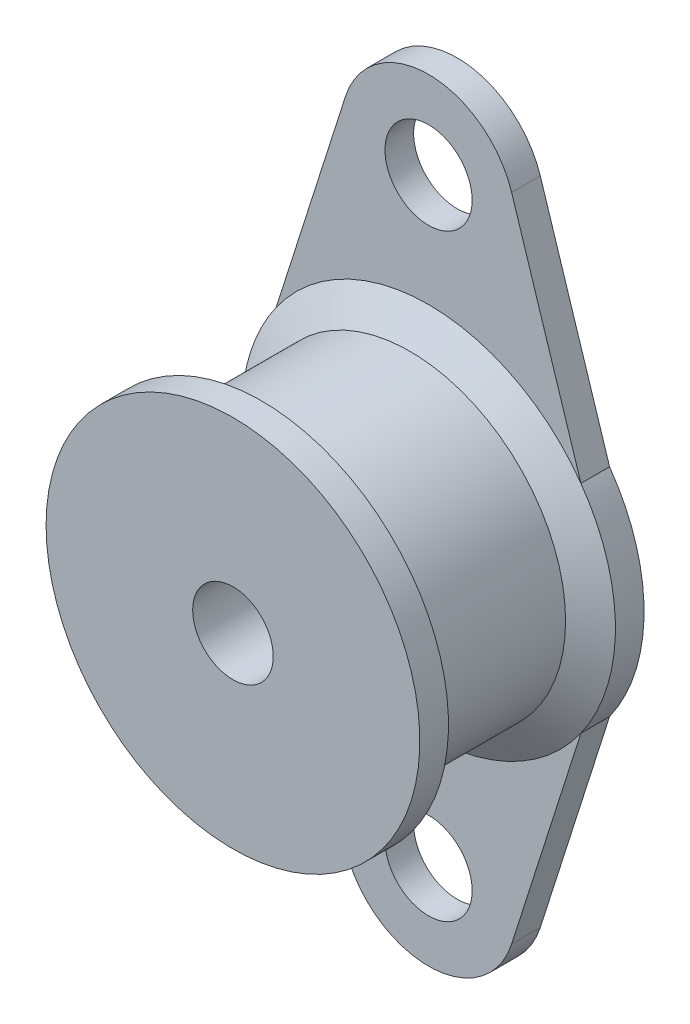
ISO-10303-21;
HEADER;
FILE_DESCRIPTION(('STEP AP214'),'2;1');
FILE_NAME('part.step','',(''),(''),'','','');
FILE_SCHEMA(('AUTOMOTIVE_DESIGN { 1 0 10303 214 1 1 1 1 }'));
ENDSEC;
DATA;
#1=APPLICATION_CONTEXT('core data for automotive mechanical design processes');
#2=APPLICATION_PROTOCOL_DEFINITION('international standard','automotive_design',2000,#1);
#3=PRODUCT_CONTEXT('',#1,'mechanical');
#4=PRODUCT('Part','Part','',(#3));
#5=PRODUCT_RELATED_PRODUCT_CATEGORY('part','',(#4));
#6=PRODUCT_DEFINITION_FORMATION('','',#4);
#7=PRODUCT_DEFINITION_CONTEXT('part definition',#1,'design');
#8=PRODUCT_DEFINITION('design','',#6,#7);
#9=PRODUCT_DEFINITION_SHAPE('','',#8);
#10=(LENGTH_UNIT() NAMED_UNIT(*) SI_UNIT(.MILLI.,.METRE.));
#11=(NAMED_UNIT(*) PLANE_ANGLE_UNIT() SI_UNIT($,.RADIAN.));
#12=(NAMED_UNIT(*) SI_UNIT($,.STERADIAN.) SOLID_ANGLE_UNIT());
#13=UNCERTAINTY_MEASURE_WITH_UNIT(LENGTH_MEASURE(1.E-05),#10,'distance_accuracy_value','');
#14=(GEOMETRIC_REPRESENTATION_CONTEXT(3) GLOBAL_UNCERTAINTY_ASSIGNED_CONTEXT((#13)) GLOBAL_UNIT_ASSIGNED_CONTEXT((#10,
#11,#12)) REPRESENTATION_CONTEXT('',''));
#15=CARTESIAN_POINT('',(0.,0.,0.));
#16=DIRECTION('',(0.,0.,1.));
#17=DIRECTION('',(1.,0.,0.));
#18=AXIS2_PLACEMENT_3D('',#15,#16,#17);
#19=CARTESIAN_POINT('',(15.,0.,18.));
#20=DIRECTION('',(0.,0.,-1.));
#21=DIRECTION('',(-1.,0.,0.));
#22=AXIS2_PLACEMENT_3D('',#19,#20,#21);
#23=PLANE('',#22);
#24=CARTESIAN_POINT('',(0.,0.,18.));
#25=DIRECTION('',(0.,0.,-1.));
#26=DIRECTION('',(-1.,0.,0.));
#27=AXIS2_PLACEMENT_3D('',#24,#25,#26);
#28=CIRCLE('',#27,15.);
#29=CARTESIAN_POINT('',(-15.,0.,18.));
#30=VERTEX_POINT('',#29);
#31=EDGE_CURVE('E288',#30,#30,#28,.T.);
#32=ORIENTED_EDGE('',*,*,#31,.F.);
#33=EDGE_LOOP('',(#32));
#34=FACE_BOUND('',#33,.T.);
#35=CARTESIAN_POINT('',(0.,0.,18.));
#36=DIRECTION('',(0.,0.,-1.));
#37=DIRECTION('',(-1.,0.,0.));
#38=AXIS2_PLACEMENT_3D('',#35,#36,#37);
#39=CIRCLE('',#38,3.233);
#40=CARTESIAN_POINT('',(-3.233,0.,18.));
#41=VERTEX_POINT('',#40);
#42=EDGE_CURVE('E297',#41,#41,#39,.T.);
#43=ORIENTED_EDGE('',*,*,#42,.T.);
#44=EDGE_LOOP('',(#43));
#45=FACE_BOUND('',#44,.T.);
#46=ADVANCED_FACE('F38',(#34,#45),#23,.F.);
#47=CARTESIAN_POINT('',(0.,0.,2.3));
#48=DIRECTION('',(0.,0.,1.));
#49=DIRECTION('',(1.,0.,0.));
#50=AXIS2_PLACEMENT_3D('',#47,#48,#49);
#51=PLANE('',#50);
#52=CARTESIAN_POINT('',(0.,24.,2.3));
#53=DIRECTION('',(0.,0.,1.));
#54=DIRECTION('',(1.,0.,0.));
#55=AXIS2_PLACEMENT_3D('',#52,#53,#54);
#56=CIRCLE('',#55,3.5);
#57=CARTESIAN_POINT('',(3.5,24.,2.3));
#58=VERTEX_POINT('',#57);
#59=EDGE_CURVE('E269',#58,#58,#56,.T.);
#60=ORIENTED_EDGE('',*,*,#59,.F.);
#61=EDGE_LOOP('',(#60));
#62=FACE_BOUND('',#61,.T.);
#63=DIRECTION('',(-0.303794352089966,-0.952737630010612,0.));
#64=VECTOR('',#63,1.);
#65=CARTESIAN_POINT('',(-6.66916341007428,26.1265604646298,2.3));
#66=LINE('',#65,#64);
#67=CARTESIAN_POINT('',(-6.66916341007428,26.1265604646298,2.3));
#68=VERTEX_POINT('',#67);
#69=CARTESIAN_POINT('',(-12.2312697491471,8.68308933062412,2.3));
#70=VERTEX_POINT('',#69);
#71=EDGE_CURVE('E57',#68,#70,#66,.T.);
#72=ORIENTED_EDGE('',*,*,#71,.T.);
#73=CARTESIAN_POINT('',(0.,0.,2.3));
#74=DIRECTION('',(0.,0.,-1.));
#75=DIRECTION('',(-1.,0.,0.));
#76=AXIS2_PLACEMENT_3D('',#73,#74,#75);
#77=CIRCLE('',#76,15.);
#78=CARTESIAN_POINT('',(12.2312697491471,8.68308933062411,2.3));
#79=VERTEX_POINT('',#78);
#80=EDGE_CURVE('E118',#70,#79,#77,.T.);
#81=ORIENTED_EDGE('',*,*,#80,.T.);
#82=DIRECTION('',(-0.303794352089966,0.952737630010612,0.));
#83=VECTOR('',#82,1.);
#84=CARTESIAN_POINT('',(12.2312697491471,8.68308933062411,2.3));
#85=LINE('',#84,#83);
#86=CARTESIAN_POINT('',(6.66916341007428,26.1265604646298,2.3));
#87=VERTEX_POINT('',#86);
#88=EDGE_CURVE('E112',#79,#87,#85,.T.);
#89=ORIENTED_EDGE('',*,*,#88,.T.);
#90=CARTESIAN_POINT('',(0.,24.,2.3));
#91=DIRECTION('',(0.,0.,1.));
#92=DIRECTION('',(1.,0.,0.));
#93=AXIS2_PLACEMENT_3D('',#90,#91,#92);
#94=CIRCLE('',#93,7.);
#95=EDGE_CURVE('E116',#87,#68,#94,.T.);
#96=ORIENTED_EDGE('',*,*,#95,.T.);
#97=EDGE_LOOP('',(#72,#81,#89,#96));
#98=FACE_BOUND('',#97,.T.);
#99=ADVANCED_FACE('F114',(#62,#98),#51,.T.);
#100=CARTESIAN_POINT('',(0.,-24.,2.3));
#101=DIRECTION('',(0.,0.,1.));
#102=DIRECTION('',(1.,0.,0.));
#103=AXIS2_PLACEMENT_3D('',#100,#101,#102);
#104=CIRCLE('',#103,3.5);
#105=CARTESIAN_POINT('',(3.5,-24.,2.3));
#106=VERTEX_POINT('',#105);
#107=EDGE_CURVE('E144',#106,#106,#104,.T.);
#108=ORIENTED_EDGE('',*,*,#107,.F.);
#109=EDGE_LOOP('',(#108));
#110=FACE_BOUND('',#109,.T.);
#111=DIRECTION('',(0.303794352089966,0.952737630010612,0.));
#112=VECTOR('',#111,1.);
#113=CARTESIAN_POINT('',(6.66916341007428,-26.1265604646298,2.3));
#114=LINE('',#113,#112);
#115=CARTESIAN_POINT('',(6.66916341007428,-26.1265604646298,2.3));
#116=VERTEX_POINT('',#115);
#117=CARTESIAN_POINT('',(12.2312697491471,-8.68308933062411,2.3));
#118=VERTEX_POINT('',#117);
#119=EDGE_CURVE('E181',#116,#118,#114,.T.);
#120=ORIENTED_EDGE('',*,*,#119,.T.);
#121=CARTESIAN_POINT('',(-12.2312697491471,-8.68308933062411,2.3));
#122=VERTEX_POINT('',#121);
#123=EDGE_CURVE('E11',#118,#122,#77,.T.);
#124=ORIENTED_EDGE('',*,*,#123,.T.);
#125=DIRECTION('',(0.303794352089966,-0.952737630010612,0.));
#126=VECTOR('',#125,1.);
#127=CARTESIAN_POINT('',(-12.2312697491471,-8.68308933062411,2.3));
#128=LINE('',#127,#126);
#129=CARTESIAN_POINT('',(-6.66916341007428,-26.1265604646298,2.3));
#130=VERTEX_POINT('',#129);
#131=EDGE_CURVE('E101',#122,#130,#128,.T.);
#132=ORIENTED_EDGE('',*,*,#131,.T.);
#133=CARTESIAN_POINT('',(0.,-24.,2.3));
#134=DIRECTION('',(0.,0.,1.));
#135=DIRECTION('',(1.,0.,0.));
#136=AXIS2_PLACEMENT_3D('',#133,#134,#135);
#137=CIRCLE('',#136,7.);
#138=EDGE_CURVE('E138',#130,#116,#137,.T.);
#139=ORIENTED_EDGE('',*,*,#138,.T.);
#140=EDGE_LOOP('',(#120,#124,#132,#139));
#141=FACE_BOUND('',#140,.T.);
#142=ADVANCED_FACE('F230',(#110,#141),#51,.T.);
#143=CARTESIAN_POINT('',(0.,0.,0.));
#144=DIRECTION('',(0.,0.,1.));
#145=DIRECTION('',(1.,0.,0.));
#146=AXIS2_PLACEMENT_3D('',#143,#144,#145);
#147=PLANE('',#146);
#148=CARTESIAN_POINT('',(0.,-24.,0.));
#149=DIRECTION('',(0.,0.,1.));
#150=DIRECTION('',(1.,0.,0.));
#151=AXIS2_PLACEMENT_3D('',#148,#149,#150);
#152=CIRCLE('',#151,3.5);
#153=CARTESIAN_POINT('',(3.5,-24.,0.));
#154=VERTEX_POINT('',#153);
#155=EDGE_CURVE('E267',#154,#154,#152,.T.);
#156=ORIENTED_EDGE('',*,*,#155,.T.);
#157=EDGE_LOOP('',(#156));
#158=FACE_BOUND('',#157,.T.);
#159=CARTESIAN_POINT('',(0.,0.,0.));
#160=DIRECTION('',(0.,0.,1.));
#161=DIRECTION('',(1.,0.,0.));
#162=AXIS2_PLACEMENT_3D('',#159,#160,#161);
#163=CIRCLE('',#162,15.);
#164=CARTESIAN_POINT('',(-12.2312697491471,8.68308933062412,0.));
#165=VERTEX_POINT('',#164);
#166=CARTESIAN_POINT('',(-12.2312697491471,-8.68308933062411,0.));
#167=VERTEX_POINT('',#166);
#168=EDGE_CURVE('E140',#165,#167,#163,.T.);
#169=ORIENTED_EDGE('',*,*,#168,.F.);
#170=DIRECTION('',(-0.303794352089966,-0.952737630010612,0.));
#171=VECTOR('',#170,1.);
#172=CARTESIAN_POINT('',(-6.66916341007428,26.1265604646298,0.));
#173=LINE('',#172,#171);
#174=CARTESIAN_POINT('',(-6.66916341007428,26.1265604646298,0.));
#175=VERTEX_POINT('',#174);
#176=EDGE_CURVE('E93',#175,#165,#173,.T.);
#177=ORIENTED_EDGE('',*,*,#176,.F.);
#178=CARTESIAN_POINT('',(0.,24.,0.));
#179=DIRECTION('',(0.,0.,1.));
#180=DIRECTION('',(1.,0.,0.));
#181=AXIS2_PLACEMENT_3D('',#178,#179,#180);
#182=CIRCLE('',#181,7.);
#183=CARTESIAN_POINT('',(6.66916341007428,26.1265604646298,0.));
#184=VERTEX_POINT('',#183);
#185=EDGE_CURVE('E87',#184,#175,#182,.T.);
#186=ORIENTED_EDGE('',*,*,#185,.F.);
#187=DIRECTION('',(-0.303794352089966,0.952737630010612,0.));
#188=VECTOR('',#187,1.);
#189=CARTESIAN_POINT('',(12.2312697491471,8.68308933062411,0.));
#190=LINE('',#189,#188);
#191=CARTESIAN_POINT('',(12.2312697491471,8.68308933062411,0.));
#192=VERTEX_POINT('',#191);
#193=EDGE_CURVE('E128',#192,#184,#190,.T.);
#194=ORIENTED_EDGE('',*,*,#193,.F.);
#195=CARTESIAN_POINT('',(0.,0.,0.));
#196=DIRECTION('',(0.,0.,1.));
#197=DIRECTION('',(1.,0.,0.));
#198=AXIS2_PLACEMENT_3D('',#195,#196,#197);
#199=CIRCLE('',#198,15.);
#200=CARTESIAN_POINT('',(12.2312697491471,-8.68308933062411,0.));
#201=VERTEX_POINT('',#200);
#202=EDGE_CURVE('E150',#201,#192,#199,.T.);
#203=ORIENTED_EDGE('',*,*,#202,.F.);
#204=DIRECTION('',(0.303794352089966,0.952737630010612,0.));
#205=VECTOR('',#204,1.);
#206=CARTESIAN_POINT('',(6.66916341007428,-26.1265604646298,0.));
#207=LINE('',#206,#205);
#208=CARTESIAN_POINT('',(6.66916341007428,-26.1265604646298,0.));
#209=VERTEX_POINT('',#208);
#210=EDGE_CURVE('E148',#209,#201,#207,.T.);
#211=ORIENTED_EDGE('',*,*,#210,.F.);
#212=CARTESIAN_POINT('',(0.,-24.,0.));
#213=DIRECTION('',(0.,0.,1.));
#214=DIRECTION('',(1.,0.,0.));
#215=AXIS2_PLACEMENT_3D('',#212,#213,#214);
#216=CIRCLE('',#215,7.);
#217=CARTESIAN_POINT('',(-6.66916341007428,-26.1265604646298,0.));
#218=VERTEX_POINT('',#217);
#219=EDGE_CURVE('E146',#218,#209,#216,.T.);
#220=ORIENTED_EDGE('',*,*,#219,.F.);
#221=DIRECTION('',(0.303794352089966,-0.952737630010612,0.));
#222=VECTOR('',#221,1.);
#223=CARTESIAN_POINT('',(-12.2312697491471,-8.68308933062411,0.));
#224=LINE('',#223,#222);
#225=EDGE_CURVE('E143',#167,#218,#224,.T.);
#226=ORIENTED_EDGE('',*,*,#225,.F.);
#227=EDGE_LOOP('',(#169,#177,#186,#194,#203,#211,#220,#226));
#228=FACE_BOUND('',#227,.T.);
#229=CARTESIAN_POINT('',(0.,24.,0.));
#230=DIRECTION('',(0.,0.,1.));
#231=DIRECTION('',(1.,0.,0.));
#232=AXIS2_PLACEMENT_3D('',#229,#230,#231);
#233=CIRCLE('',#232,3.5);
#234=CARTESIAN_POINT('',(3.5,24.,0.));
#235=VERTEX_POINT('',#234);
#236=EDGE_CURVE('E273',#235,#235,#233,.T.);
#237=ORIENTED_EDGE('',*,*,#236,.T.);
#238=EDGE_LOOP('',(#237));
#239=FACE_BOUND('',#238,.T.);
#240=ADVANCED_FACE('F203',(#158,#228,#239),#147,.F.);
#241=CARTESIAN_POINT('',(0.,0.,2.3));
#242=DIRECTION('',(0.,0.,-1.));
#243=DIRECTION('',(-1.,0.,0.));
#244=AXIS2_PLACEMENT_3D('',#241,#242,#243);
#245=CYLINDRICAL_SURFACE('',#244,15.);
#246=ORIENTED_EDGE('',*,*,#168,.T.);
#247=DIRECTION('',(0.,0.,-1.));
#248=VECTOR('',#247,1.);
#249=CARTESIAN_POINT('',(-12.2312697491471,-8.68308933062411,2.3));
#250=LINE('',#249,#248);
#251=EDGE_CURVE('E48',#122,#167,#250,.T.);
#252=ORIENTED_EDGE('',*,*,#251,.F.);
#253=CARTESIAN_POINT('',(0.,0.,2.3));
#254=DIRECTION('',(0.,0.,1.));
#255=DIRECTION('',(1.,0.,0.));
#256=AXIS2_PLACEMENT_3D('',#253,#254,#255);
#257=CIRCLE('',#256,15.);
#258=EDGE_CURVE('E155',#70,#122,#257,.T.);
#259=ORIENTED_EDGE('',*,*,#258,.F.);
#260=DIRECTION('',(0.,0.,-1.));
#261=VECTOR('',#260,1.);
#262=CARTESIAN_POINT('',(-12.2312697491471,8.68308933062412,2.3));
#263=LINE('',#262,#261);
#264=EDGE_CURVE('E134',#70,#165,#263,.T.);
#265=ORIENTED_EDGE('',*,*,#264,.T.);
#266=EDGE_LOOP('',(#246,#252,#259,#265));
#267=FACE_BOUND('',#266,.T.);
#268=ADVANCED_FACE('F40',(#267),#245,.T.);
#269=CARTESIAN_POINT('',(-12.2312697491471,-8.68308933062411,2.3));
#270=DIRECTION('',(0.952737630010612,0.303794352089966,0.));
#271=DIRECTION('',(-0.303794352089966,0.952737630010612,0.));
#272=AXIS2_PLACEMENT_3D('',#269,#270,#271);
#273=PLANE('',#272);
#274=ORIENTED_EDGE('',*,*,#225,.T.);
#275=DIRECTION('',(0.,0.,-1.));
#276=VECTOR('',#275,1.);
#277=CARTESIAN_POINT('',(-6.66916341007428,-26.1265604646298,2.3));
#278=LINE('',#277,#276);
#279=EDGE_CURVE('E160',#130,#218,#278,.T.);
#280=ORIENTED_EDGE('',*,*,#279,.F.);
#281=ORIENTED_EDGE('',*,*,#131,.F.);
#282=ORIENTED_EDGE('',*,*,#251,.T.);
#283=EDGE_LOOP('',(#274,#280,#281,#282));
#284=FACE_BOUND('',#283,.T.);
#285=ADVANCED_FACE('F263',(#284),#273,.F.);
#286=CARTESIAN_POINT('',(0.,-24.,2.3));
#287=DIRECTION('',(0.,0.,-1.));
#288=DIRECTION('',(-1.,0.,0.));
#289=AXIS2_PLACEMENT_3D('',#286,#287,#288);
#290=CYLINDRICAL_SURFACE('',#289,7.);
#291=ORIENTED_EDGE('',*,*,#219,.T.);
#292=DIRECTION('',(0.,0.,-1.));
#293=VECTOR('',#292,1.);
#294=CARTESIAN_POINT('',(6.66916341007428,-26.1265604646298,2.3));
#295=LINE('',#294,#293);
#296=EDGE_CURVE('E157',#116,#209,#295,.T.);
#297=ORIENTED_EDGE('',*,*,#296,.F.);
#298=ORIENTED_EDGE('',*,*,#138,.F.);
#299=ORIENTED_EDGE('',*,*,#279,.T.);
#300=EDGE_LOOP('',(#291,#297,#298,#299));
#301=FACE_BOUND('',#300,.T.);
#302=ADVANCED_FACE('F375',(#301),#290,.T.);
#303=CARTESIAN_POINT('',(6.66916341007428,-26.1265604646298,2.3));
#304=DIRECTION('',(-0.952737630010612,0.303794352089966,0.));
#305=DIRECTION('',(-0.303794352089966,-0.952737630010612,0.));
#306=AXIS2_PLACEMENT_3D('',#303,#304,#305);
#307=PLANE('',#306);
#308=ORIENTED_EDGE('',*,*,#210,.T.);
#309=DIRECTION('',(0.,0.,-1.));
#310=VECTOR('',#309,1.);
#311=CARTESIAN_POINT('',(12.2312697491471,-8.68308933062411,2.3));
#312=LINE('',#311,#310);
#313=EDGE_CURVE('E161',#118,#201,#312,.T.);
#314=ORIENTED_EDGE('',*,*,#313,.F.);
#315=ORIENTED_EDGE('',*,*,#119,.F.);
#316=ORIENTED_EDGE('',*,*,#296,.T.);
#317=EDGE_LOOP('',(#308,#314,#315,#316));
#318=FACE_BOUND('',#317,.T.);
#319=ADVANCED_FACE('F364',(#318),#307,.F.);
#320=CARTESIAN_POINT('',(0.,0.,2.3));
#321=DIRECTION('',(0.,0.,-1.));
#322=DIRECTION('',(-1.,0.,0.));
#323=AXIS2_PLACEMENT_3D('',#320,#321,#322);
#324=CYLINDRICAL_SURFACE('',#323,15.);
#325=ORIENTED_EDGE('',*,*,#202,.T.);
#326=DIRECTION('',(0.,0.,-1.));
#327=VECTOR('',#326,1.);
#328=CARTESIAN_POINT('',(12.2312697491471,8.68308933062411,2.3));
#329=LINE('',#328,#327);
#330=EDGE_CURVE('E129',#79,#192,#329,.T.);
#331=ORIENTED_EDGE('',*,*,#330,.F.);
#332=CARTESIAN_POINT('',(0.,0.,2.3));
#333=DIRECTION('',(0.,0.,1.));
#334=DIRECTION('',(1.,0.,0.));
#335=AXIS2_PLACEMENT_3D('',#332,#333,#334);
#336=CIRCLE('',#335,15.);
#337=EDGE_CURVE('E123',#118,#79,#336,.T.);
#338=ORIENTED_EDGE('',*,*,#337,.F.);
#339=ORIENTED_EDGE('',*,*,#313,.T.);
#340=EDGE_LOOP('',(#325,#331,#338,#339));
#341=FACE_BOUND('',#340,.T.);
#342=ADVANCED_FACE('F196',(#341),#324,.T.);
#343=CARTESIAN_POINT('',(12.2312697491471,8.68308933062411,2.3));
#344=DIRECTION('',(-0.952737630010612,-0.303794352089966,0.));
#345=DIRECTION('',(0.303794352089966,-0.952737630010612,0.));
#346=AXIS2_PLACEMENT_3D('',#343,#344,#345);
#347=PLANE('',#346);
#348=ORIENTED_EDGE('',*,*,#193,.T.);
#349=DIRECTION('',(0.,0.,-1.));
#350=VECTOR('',#349,1.);
#351=CARTESIAN_POINT('',(6.66916341007428,26.1265604646298,2.3));
#352=LINE('',#351,#350);
#353=EDGE_CURVE('E125',#87,#184,#352,.T.);
#354=ORIENTED_EDGE('',*,*,#353,.F.);
#355=ORIENTED_EDGE('',*,*,#88,.F.);
#356=ORIENTED_EDGE('',*,*,#330,.T.);
#357=EDGE_LOOP('',(#348,#354,#355,#356));
#358=FACE_BOUND('',#357,.T.);
#359=ADVANCED_FACE('F126',(#358),#347,.F.);
#360=CARTESIAN_POINT('',(0.,24.,2.3));
#361=DIRECTION('',(0.,0.,-1.));
#362=DIRECTION('',(-1.,0.,0.));
#363=AXIS2_PLACEMENT_3D('',#360,#361,#362);
#364=CYLINDRICAL_SURFACE('',#363,7.);
#365=ORIENTED_EDGE('',*,*,#185,.T.);
#366=DIRECTION('',(0.,0.,-1.));
#367=VECTOR('',#366,1.);
#368=CARTESIAN_POINT('',(-6.66916341007428,26.1265604646298,2.3));
#369=LINE('',#368,#367);
#370=EDGE_CURVE('E130',#68,#175,#369,.T.);
#371=ORIENTED_EDGE('',*,*,#370,.F.);
#372=ORIENTED_EDGE('',*,*,#95,.F.);
#373=ORIENTED_EDGE('',*,*,#353,.T.);
#374=EDGE_LOOP('',(#365,#371,#372,#373));
#375=FACE_BOUND('',#374,.T.);
#376=ADVANCED_FACE('F132',(#375),#364,.T.);
#377=CARTESIAN_POINT('',(-6.66916341007428,26.1265604646298,2.3));
#378=DIRECTION('',(0.952737630010612,-0.303794352089966,0.));
#379=DIRECTION('',(0.303794352089966,0.952737630010612,0.));
#380=AXIS2_PLACEMENT_3D('',#377,#378,#379);
#381=PLANE('',#380);
#382=ORIENTED_EDGE('',*,*,#176,.T.);
#383=ORIENTED_EDGE('',*,*,#264,.F.);
#384=ORIENTED_EDGE('',*,*,#71,.F.);
#385=ORIENTED_EDGE('',*,*,#370,.T.);
#386=EDGE_LOOP('',(#382,#383,#384,#385));
#387=FACE_BOUND('',#386,.T.);
#388=ADVANCED_FACE('F211',(#387),#381,.F.);
#389=CARTESIAN_POINT('',(0.,-24.,2.3));
#390=DIRECTION('',(0.,0.,-1.));
#391=DIRECTION('',(-1.,0.,0.));
#392=AXIS2_PLACEMENT_3D('',#389,#390,#391);
#393=CYLINDRICAL_SURFACE('',#392,3.5);
#394=ORIENTED_EDGE('',*,*,#107,.T.);
#395=EDGE_LOOP('',(#394));
#396=FACE_BOUND('',#395,.T.);
#397=ORIENTED_EDGE('',*,*,#155,.F.);
#398=EDGE_LOOP('',(#397));
#399=FACE_BOUND('',#398,.T.);
#400=ADVANCED_FACE('F213',(#396,#399),#393,.F.);
#401=CARTESIAN_POINT('',(0.,24.,2.3));
#402=DIRECTION('',(0.,0.,-1.));
#403=DIRECTION('',(-1.,0.,0.));
#404=AXIS2_PLACEMENT_3D('',#401,#402,#403);
#405=CYLINDRICAL_SURFACE('',#404,3.5);
#406=ORIENTED_EDGE('',*,*,#59,.T.);
#407=EDGE_LOOP('',(#406));
#408=FACE_BOUND('',#407,.T.);
#409=ORIENTED_EDGE('',*,*,#236,.F.);
#410=EDGE_LOOP('',(#409));
#411=FACE_BOUND('',#410,.T.);
#412=ADVANCED_FACE('F219',(#408,#411),#405,.F.);
#413=CARTESIAN_POINT('',(0.,0.,3.8));
#414=DIRECTION('',(0.,0.,-1.));
#415=DIRECTION('',(-1.,0.,0.));
#416=AXIS2_PLACEMENT_3D('',#413,#414,#415);
#417=CONICAL_SURFACE('',#416,12.5,1.03037682652431);
#418=ORIENTED_EDGE('',*,*,#80,.F.);
#419=ORIENTED_EDGE('',*,*,#258,.T.);
#420=ORIENTED_EDGE('',*,*,#123,.F.);
#421=ORIENTED_EDGE('',*,*,#337,.T.);
#422=EDGE_LOOP('',(#418,#419,#420,#421));
#423=FACE_BOUND('',#422,.T.);
#424=CARTESIAN_POINT('',(0.,0.,3.8));
#425=DIRECTION('',(0.,0.,-1.));
#426=DIRECTION('',(-1.,0.,0.));
#427=AXIS2_PLACEMENT_3D('',#424,#425,#426);
#428=CIRCLE('',#427,12.5);
#429=CARTESIAN_POINT('',(-12.5,0.,3.8));
#430=VERTEX_POINT('',#429);
#431=EDGE_CURVE('E277',#430,#430,#428,.T.);
#432=ORIENTED_EDGE('',*,*,#431,.T.);
#433=EDGE_LOOP('',(#432));
#434=FACE_BOUND('',#433,.T.);
#435=ADVANCED_FACE('F250',(#423,#434),#417,.T.);
#436=CARTESIAN_POINT('',(0.,0.,15.7));
#437=DIRECTION('',(0.,0.,-1.));
#438=DIRECTION('',(-1.,0.,0.));
#439=AXIS2_PLACEMENT_3D('',#436,#437,#438);
#440=CYLINDRICAL_SURFACE('',#439,12.5);
#441=ORIENTED_EDGE('',*,*,#431,.F.);
#442=EDGE_LOOP('',(#441));
#443=FACE_BOUND('',#442,.T.);
#444=CARTESIAN_POINT('',(0.,0.,14.2));
#445=DIRECTION('',(0.,0.,-1.));
#446=DIRECTION('',(-1.,0.,0.));
#447=AXIS2_PLACEMENT_3D('',#444,#445,#446);
#448=CIRCLE('',#447,12.5);
#449=CARTESIAN_POINT('',(-12.5,0.,14.2));
#450=VERTEX_POINT('',#449);
#451=EDGE_CURVE('E279',#450,#450,#448,.T.);
#452=ORIENTED_EDGE('',*,*,#451,.T.);
#453=EDGE_LOOP('',(#452));
#454=FACE_BOUND('',#453,.T.);
#455=ADVANCED_FACE('F246',(#443,#454),#440,.T.);
#456=CARTESIAN_POINT('',(0.,0.,15.7));
#457=DIRECTION('',(0.,0.,1.));
#458=DIRECTION('',(1.,0.,0.));
#459=AXIS2_PLACEMENT_3D('',#456,#457,#458);
#460=CONICAL_SURFACE('',#459,15.,1.03037682652431);
#461=ORIENTED_EDGE('',*,*,#451,.F.);
#462=EDGE_LOOP('',(#461));
#463=FACE_BOUND('',#462,.T.);
#464=CARTESIAN_POINT('',(0.,0.,15.7));
#465=DIRECTION('',(0.,0.,-1.));
#466=DIRECTION('',(-1.,0.,0.));
#467=AXIS2_PLACEMENT_3D('',#464,#465,#466);
#468=CIRCLE('',#467,15.);
#469=CARTESIAN_POINT('',(-15.,0.,15.7));
#470=VERTEX_POINT('',#469);
#471=EDGE_CURVE('E283',#470,#470,#468,.T.);
#472=ORIENTED_EDGE('',*,*,#471,.T.);
#473=EDGE_LOOP('',(#472));
#474=FACE_BOUND('',#473,.T.);
#475=ADVANCED_FACE('F242',(#463,#474),#460,.T.);
#476=CARTESIAN_POINT('',(0.,0.,18.));
#477=DIRECTION('',(0.,0.,-1.));
#478=DIRECTION('',(-1.,0.,0.));
#479=AXIS2_PLACEMENT_3D('',#476,#477,#478);
#480=CYLINDRICAL_SURFACE('',#479,15.);
#481=ORIENTED_EDGE('',*,*,#471,.F.);
#482=EDGE_LOOP('',(#481));
#483=FACE_BOUND('',#482,.T.);
#484=ORIENTED_EDGE('',*,*,#31,.T.);
#485=EDGE_LOOP('',(#484));
#486=FACE_BOUND('',#485,.T.);
#487=ADVANCED_FACE('F239',(#483,#486),#480,.T.);
#488=CARTESIAN_POINT('',(0.,0.,10.8));
#489=DIRECTION('',(0.,0.,1.));
#490=DIRECTION('',(1.,0.,0.));
#491=AXIS2_PLACEMENT_3D('',#488,#489,#490);
#492=PLANE('',#491);
#493=CARTESIAN_POINT('',(0.,0.,10.8));
#494=DIRECTION('',(0.,0.,-1.));
#495=DIRECTION('',(-1.,0.,0.));
#496=AXIS2_PLACEMENT_3D('',#493,#494,#495);
#497=CIRCLE('',#496,4.);
#498=CARTESIAN_POINT('',(-4.,0.,10.8));
#499=VERTEX_POINT('',#498);
#500=EDGE_CURVE('E291',#499,#499,#497,.T.);
#501=ORIENTED_EDGE('',*,*,#500,.F.);
#502=EDGE_LOOP('',(#501));
#503=FACE_BOUND('',#502,.T.);
#504=ADVANCED_FACE('F237',(#503),#492,.T.);
#505=CARTESIAN_POINT('',(0.,0.,11.3));
#506=DIRECTION('',(0.,0.,-1.));
#507=DIRECTION('',(-1.,0.,0.));
#508=AXIS2_PLACEMENT_3D('',#505,#506,#507);
#509=CONICAL_SURFACE('',#508,3.233,0.993093268156268);
#510=ORIENTED_EDGE('',*,*,#500,.T.);
#511=EDGE_LOOP('',(#510));
#512=FACE_BOUND('',#511,.T.);
#513=CARTESIAN_POINT('',(0.,0.,11.3));
#514=DIRECTION('',(0.,0.,-1.));
#515=DIRECTION('',(-1.,0.,0.));
#516=AXIS2_PLACEMENT_3D('',#513,#514,#515);
#517=CIRCLE('',#516,3.233);
#518=CARTESIAN_POINT('',(-3.233,0.,11.3));
#519=VERTEX_POINT('',#518);
#520=EDGE_CURVE('E294',#519,#519,#517,.T.);
#521=ORIENTED_EDGE('',*,*,#520,.F.);
#522=EDGE_LOOP('',(#521));
#523=FACE_BOUND('',#522,.T.);
#524=ADVANCED_FACE('F303',(#512,#523),#509,.F.);
#525=CARTESIAN_POINT('',(0.,0.,18.));
#526=DIRECTION('',(0.,0.,-1.));
#527=DIRECTION('',(-1.,0.,0.));
#528=AXIS2_PLACEMENT_3D('',#525,#526,#527);
#529=CYLINDRICAL_SURFACE('',#528,3.233);
#530=ORIENTED_EDGE('',*,*,#520,.T.);
#531=EDGE_LOOP('',(#530));
#532=FACE_BOUND('',#531,.T.);
#533=ORIENTED_EDGE('',*,*,#42,.F.);
#534=EDGE_LOOP('',(#533));
#535=FACE_BOUND('',#534,.T.);
#536=ADVANCED_FACE('F301',(#532,#535),#529,.F.);
#537=CLOSED_SHELL('',(#46,#99,#142,#240,#268,#285,#302,#319,#342,#359,#376,#388,#400,#412,#435,
#455,#475,#487,#504,#524,#536));
#538=MANIFOLD_SOLID_BREP('B2',#537);
#539=ADVANCED_BREP_SHAPE_REPRESENTATION('',(#18,#538),#14);
#540=SHAPE_DEFINITION_REPRESENTATION(#9,#539);
ENDSEC;
END-ISO-10303-21;
